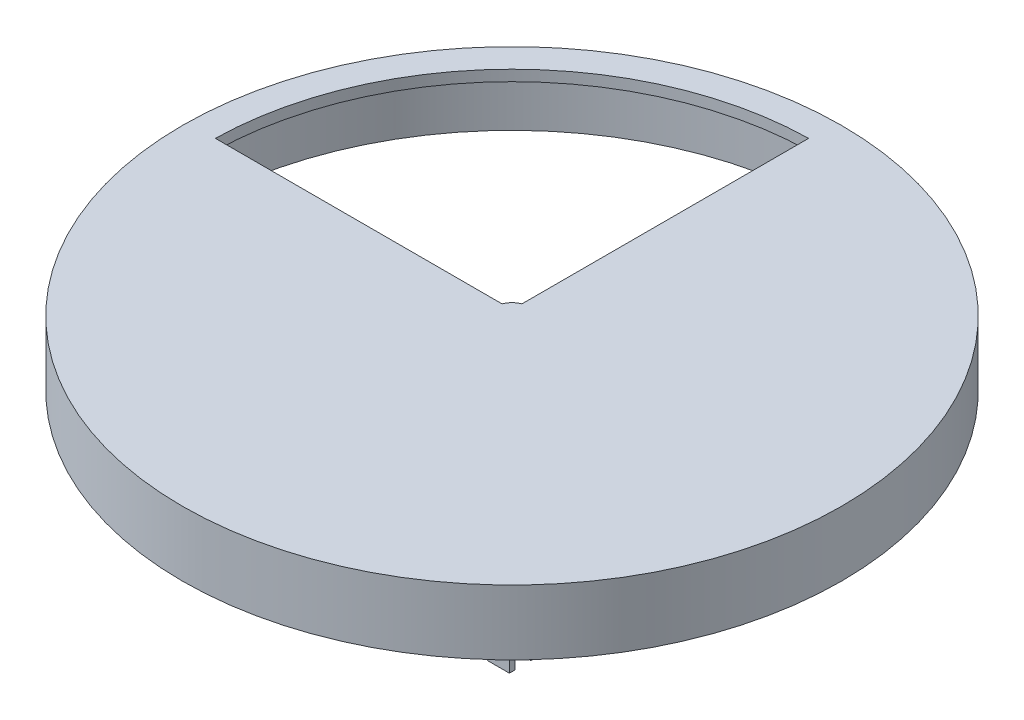
ISO-10303-21;
HEADER;
FILE_DESCRIPTION(('STEP AP214'),'2;1');
FILE_NAME('part.step','',(''),(''),'','','');
FILE_SCHEMA(('AUTOMOTIVE_DESIGN { 1 0 10303 214 1 1 1 1 }'));
ENDSEC;
DATA;
#1=APPLICATION_CONTEXT('core data for automotive mechanical design processes');
#2=APPLICATION_PROTOCOL_DEFINITION('international standard','automotive_design',2000,#1);
#3=PRODUCT_CONTEXT('',#1,'mechanical');
#4=PRODUCT('Part','Part','',(#3));
#5=PRODUCT_RELATED_PRODUCT_CATEGORY('part','',(#4));
#6=PRODUCT_DEFINITION_FORMATION('','',#4);
#7=PRODUCT_DEFINITION_CONTEXT('part definition',#1,'design');
#8=PRODUCT_DEFINITION('design','',#6,#7);
#9=PRODUCT_DEFINITION_SHAPE('','',#8);
#10=(LENGTH_UNIT() NAMED_UNIT(*) SI_UNIT(.MILLI.,.METRE.));
#11=(NAMED_UNIT(*) PLANE_ANGLE_UNIT() SI_UNIT($,.RADIAN.));
#12=(NAMED_UNIT(*) SI_UNIT($,.STERADIAN.) SOLID_ANGLE_UNIT());
#13=UNCERTAINTY_MEASURE_WITH_UNIT(LENGTH_MEASURE(1.E-05),#10,'distance_accuracy_value','');
#14=(GEOMETRIC_REPRESENTATION_CONTEXT(3) GLOBAL_UNCERTAINTY_ASSIGNED_CONTEXT((#13)) GLOBAL_UNIT_ASSIGNED_CONTEXT((#10,
#11,#12)) REPRESENTATION_CONTEXT('',''));
#15=CARTESIAN_POINT('',(0.,0.,0.));
#16=DIRECTION('',(0.,0.,1.));
#17=DIRECTION('',(1.,0.,0.));
#18=AXIS2_PLACEMENT_3D('',#15,#16,#17);
#19=CARTESIAN_POINT('',(0.,-10.,0.));
#20=DIRECTION('',(0.,1.,0.));
#21=DIRECTION('',(0.,0.,1.));
#22=AXIS2_PLACEMENT_3D('',#19,#20,#21);
#23=CYLINDRICAL_SURFACE('',#22,3.);
#24=DIRECTION('',(0.,1.,0.));
#25=VECTOR('',#24,1.);
#26=CARTESIAN_POINT('',(1.6583123951777,-10.,-2.5));
#27=LINE('',#26,#25);
#28=CARTESIAN_POINT('',(1.6583123951777,-10.,-2.5));
#29=VERTEX_POINT('',#28);
#30=CARTESIAN_POINT('',(1.6583123951777,0.,-2.5));
#31=VERTEX_POINT('',#30);
#32=EDGE_CURVE('E175',#29,#31,#27,.T.);
#33=ORIENTED_EDGE('',*,*,#32,.F.);
#34=CARTESIAN_POINT('',(0.,-10.,0.));
#35=DIRECTION('',(0.,-1.,0.));
#36=DIRECTION('',(0.,0.,-1.));
#37=AXIS2_PLACEMENT_3D('',#34,#35,#36);
#38=CIRCLE('',#37,3.);
#39=CARTESIAN_POINT('',(-2.02043256713658,-10.,2.21762310631313));
#40=VERTEX_POINT('',#39);
#41=EDGE_CURVE('E271',#40,#29,#38,.T.);
#42=ORIENTED_EDGE('',*,*,#41,.F.);
#43=DIRECTION('',(0.,1.,0.));
#44=VECTOR('',#43,1.);
#45=CARTESIAN_POINT('',(-2.02043256713658,-10.,2.21762310631313));
#46=LINE('',#45,#44);
#47=CARTESIAN_POINT('',(-2.02043256713658,0.,2.21762310631313));
#48=VERTEX_POINT('',#47);
#49=EDGE_CURVE('E239',#40,#48,#46,.T.);
#50=ORIENTED_EDGE('',*,*,#49,.T.);
#51=CARTESIAN_POINT('',(0.,0.,0.));
#52=DIRECTION('',(0.,1.,0.));
#53=DIRECTION('',(0.,0.,1.));
#54=AXIS2_PLACEMENT_3D('',#51,#52,#53);
#55=CIRCLE('',#54,3.);
#56=CARTESIAN_POINT('',(-2.8284271247462,0.,-0.999999999999987));
#57=VERTEX_POINT('',#56);
#58=EDGE_CURVE('E287',#48,#57,#55,.F.);
#59=ORIENTED_EDGE('',*,*,#58,.T.);
#60=DIRECTION('',(0.,1.,0.));
#61=VECTOR('',#60,1.);
#62=CARTESIAN_POINT('',(-2.8284271247462,-8.,-0.999999999999987));
#63=LINE('',#62,#61);
#64=CARTESIAN_POINT('',(-2.8284271247462,2.,-0.999999999999987));
#65=VERTEX_POINT('',#64);
#66=EDGE_CURVE('E263',#57,#65,#63,.T.);
#67=ORIENTED_EDGE('',*,*,#66,.T.);
#68=CARTESIAN_POINT('',(0.,2.,0.));
#69=DIRECTION('',(0.,1.,0.));
#70=DIRECTION('',(0.,0.,1.));
#71=AXIS2_PLACEMENT_3D('',#68,#69,#70);
#72=CIRCLE('',#71,2.99999999999999);
#73=CARTESIAN_POINT('',(-1.,2.,-2.82842712474619));
#74=VERTEX_POINT('',#73);
#75=EDGE_CURVE('E251',#65,#74,#72,.F.);
#76=ORIENTED_EDGE('',*,*,#75,.T.);
#77=DIRECTION('',(0.,1.,0.));
#78=VECTOR('',#77,1.);
#79=CARTESIAN_POINT('',(-1.,-8.,-2.82842712474619));
#80=LINE('',#79,#78);
#81=CARTESIAN_POINT('',(-1.,0.,-2.82842712474619));
#82=VERTEX_POINT('',#81);
#83=EDGE_CURVE('E261',#82,#74,#80,.T.);
#84=ORIENTED_EDGE('',*,*,#83,.F.);
#85=EDGE_CURVE('E288',#82,#31,#55,.F.);
#86=ORIENTED_EDGE('',*,*,#85,.T.);
#87=EDGE_LOOP('',(#33,#42,#50,#59,#67,#76,#84,#86));
#88=FACE_BOUND('',#87,.T.);
#89=ADVANCED_FACE('F39',(#88),#23,.T.);
#90=CARTESIAN_POINT('',(1.6583123951777,-10.,2.5));
#91=VERTEX_POINT('',#90);
#92=CARTESIAN_POINT('',(-1.6583123951777,-10.,2.5));
#93=VERTEX_POINT('',#92);
#94=EDGE_CURVE('E274',#91,#93,#38,.T.);
#95=ORIENTED_EDGE('',*,*,#94,.F.);
#96=DIRECTION('',(0.,1.,0.));
#97=VECTOR('',#96,1.);
#98=CARTESIAN_POINT('',(1.6583123951777,-10.,2.5));
#99=LINE('',#98,#97);
#100=CARTESIAN_POINT('',(1.6583123951777,0.,2.5));
#101=VERTEX_POINT('',#100);
#102=EDGE_CURVE('E243',#91,#101,#99,.T.);
#103=ORIENTED_EDGE('',*,*,#102,.T.);
#104=CARTESIAN_POINT('',(-1.6583123951777,0.,2.5));
#105=VERTEX_POINT('',#104);
#106=EDGE_CURVE('E291',#101,#105,#55,.F.);
#107=ORIENTED_EDGE('',*,*,#106,.T.);
#108=DIRECTION('',(0.,1.,0.));
#109=VECTOR('',#108,1.);
#110=CARTESIAN_POINT('',(-1.6583123951777,-10.,2.5));
#111=LINE('',#110,#109);
#112=EDGE_CURVE('E241',#105,#93,#111,.F.);
#113=ORIENTED_EDGE('',*,*,#112,.T.);
#114=EDGE_LOOP('',(#95,#103,#107,#113));
#115=FACE_BOUND('',#114,.T.);
#116=ADVANCED_FACE('F371',(#115),#23,.T.);
#117=CARTESIAN_POINT('',(0.,-10.,0.));
#118=DIRECTION('',(0.,-1.,0.));
#119=DIRECTION('',(0.,0.,-1.));
#120=AXIS2_PLACEMENT_3D('',#117,#118,#119);
#121=PLANE('',#120);
#122=DIRECTION('',(-1.,0.,0.));
#123=VECTOR('',#122,1.);
#124=CARTESIAN_POINT('',(0.,-10.,2.5));
#125=LINE('',#124,#123);
#126=EDGE_CURVE('E301',#91,#93,#125,.T.);
#127=ORIENTED_EDGE('',*,*,#126,.F.);
#128=ORIENTED_EDGE('',*,*,#94,.T.);
#129=EDGE_LOOP('',(#127,#128));
#130=FACE_BOUND('',#129,.T.);
#131=ADVANCED_FACE('F388',(#130),#121,.T.);
#132=CARTESIAN_POINT('',(0.,2.,0.));
#133=DIRECTION('',(0.,1.,0.));
#134=DIRECTION('',(0.,0.,1.));
#135=AXIS2_PLACEMENT_3D('',#132,#133,#134);
#136=PLANE('',#135);
#137=CARTESIAN_POINT('',(0.,2.,0.));
#138=DIRECTION('',(0.,1.,0.));
#139=DIRECTION('',(0.,0.,1.));
#140=AXIS2_PLACEMENT_3D('',#137,#138,#139);
#141=CIRCLE('',#140,61.);
#142=CARTESIAN_POINT('',(0.,2.,61.));
#143=VERTEX_POINT('',#142);
#144=EDGE_CURVE('E284',#143,#143,#141,.T.);
#145=ORIENTED_EDGE('',*,*,#144,.T.);
#146=EDGE_LOOP('',(#145));
#147=FACE_BOUND('',#146,.T.);
#148=DIRECTION('',(-1.,0.,0.));
#149=VECTOR('',#148,1.);
#150=CARTESIAN_POINT('',(0.,2.,-0.999999999999987));
#151=LINE('',#150,#149);
#152=CARTESIAN_POINT('',(-55.8834595248794,2.,-0.999999999999986));
#153=VERTEX_POINT('',#152);
#154=EDGE_CURVE('E248',#65,#153,#151,.T.);
#155=ORIENTED_EDGE('',*,*,#154,.T.);
#156=CARTESIAN_POINT('',(1.11022302462516E-13,2.,1.07552855510562E-13));
#157=DIRECTION('',(0.,1.,0.));
#158=DIRECTION('',(0.,0.,1.));
#159=AXIS2_PLACEMENT_3D('',#156,#157,#158);
#160=CIRCLE('',#159,55.8924060000001);
#161=CARTESIAN_POINT('',(-1.,2.,-55.8834595248794));
#162=VERTEX_POINT('',#161);
#163=EDGE_CURVE('E245',#153,#162,#160,.F.);
#164=ORIENTED_EDGE('',*,*,#163,.T.);
#165=DIRECTION('',(0.,0.,1.));
#166=VECTOR('',#165,1.);
#167=CARTESIAN_POINT('',(-1.,2.,0.));
#168=LINE('',#167,#166);
#169=EDGE_CURVE('E254',#162,#74,#168,.T.);
#170=ORIENTED_EDGE('',*,*,#169,.T.);
#171=ORIENTED_EDGE('',*,*,#75,.F.);
#172=EDGE_LOOP('',(#155,#164,#170,#171));
#173=FACE_BOUND('',#172,.T.);
#174=ADVANCED_FACE('F356',(#147,#173),#136,.T.);
#175=CARTESIAN_POINT('',(0.,0.,0.));
#176=DIRECTION('',(0.,1.,0.));
#177=DIRECTION('',(0.,0.,1.));
#178=AXIS2_PLACEMENT_3D('',#175,#176,#177);
#179=PLANE('',#178);
#180=CARTESIAN_POINT('',(0.,0.,0.));
#181=DIRECTION('',(0.,-1.,0.));
#182=DIRECTION('',(0.,0.,-1.));
#183=AXIS2_PLACEMENT_3D('',#180,#181,#182);
#184=CIRCLE('',#183,59.);
#185=CARTESIAN_POINT('',(0.,0.,-59.));
#186=VERTEX_POINT('',#185);
#187=EDGE_CURVE('E279',#186,#186,#184,.T.);
#188=ORIENTED_EDGE('',*,*,#187,.T.);
#189=EDGE_LOOP('',(#188));
#190=FACE_BOUND('',#189,.T.);
#191=CARTESIAN_POINT('',(2.00710285655807,0.,-2.22969462554773));
#192=VERTEX_POINT('',#191);
#193=CARTESIAN_POINT('',(2.01662421689778,0.,2.22108684382701));
#194=VERTEX_POINT('',#193);
#195=EDGE_CURVE('E191',#192,#194,#55,.F.);
#196=ORIENTED_EDGE('',*,*,#195,.F.);
#197=DIRECTION('',(0.,0.,-1.));
#198=VECTOR('',#197,1.);
#199=CARTESIAN_POINT('',(2.00710285655807,0.,-1.50206162252414));
#200=LINE('',#199,#198);
#201=CARTESIAN_POINT('',(2.00710285655807,0.,-2.5));
#202=VERTEX_POINT('',#201);
#203=EDGE_CURVE('E179',#192,#202,#200,.T.);
#204=ORIENTED_EDGE('',*,*,#203,.T.);
#205=DIRECTION('',(1.,0.,0.));
#206=VECTOR('',#205,1.);
#207=CARTESIAN_POINT('',(-1.60766938826074,0.,-2.5));
#208=LINE('',#207,#206);
#209=EDGE_CURVE('E169',#31,#202,#208,.T.);
#210=ORIENTED_EDGE('',*,*,#209,.F.);
#211=ORIENTED_EDGE('',*,*,#85,.F.);
#212=DIRECTION('',(0.,0.,1.));
#213=VECTOR('',#212,1.);
#214=CARTESIAN_POINT('',(-1.,0.,0.));
#215=LINE('',#214,#213);
#216=CARTESIAN_POINT('',(-1.,0.,-55.8834595248794));
#217=VERTEX_POINT('',#216);
#218=EDGE_CURVE('E268',#217,#82,#215,.T.);
#219=ORIENTED_EDGE('',*,*,#218,.F.);
#220=CARTESIAN_POINT('',(1.11022302462516E-13,0.,1.07552855510562E-13));
#221=DIRECTION('',(0.,1.,0.));
#222=DIRECTION('',(0.,0.,1.));
#223=AXIS2_PLACEMENT_3D('',#220,#221,#222);
#224=CIRCLE('',#223,55.8924060000001);
#225=CARTESIAN_POINT('',(-55.8834595248794,0.,-0.999999999999986));
#226=VERTEX_POINT('',#225);
#227=EDGE_CURVE('E290',#226,#217,#224,.F.);
#228=ORIENTED_EDGE('',*,*,#227,.F.);
#229=DIRECTION('',(-1.,0.,0.));
#230=VECTOR('',#229,1.);
#231=CARTESIAN_POINT('',(0.,0.,-0.999999999999987));
#232=LINE('',#231,#230);
#233=EDGE_CURVE('E260',#57,#226,#232,.T.);
#234=ORIENTED_EDGE('',*,*,#233,.F.);
#235=ORIENTED_EDGE('',*,*,#58,.F.);
#236=DIRECTION('',(0.,0.,1.));
#237=VECTOR('',#236,1.);
#238=CARTESIAN_POINT('',(-2.02043256713658,0.,1.5));
#239=LINE('',#238,#237);
#240=CARTESIAN_POINT('',(-2.02043256713658,0.,2.5));
#241=VERTEX_POINT('',#240);
#242=EDGE_CURVE('E62',#48,#241,#239,.T.);
#243=ORIENTED_EDGE('',*,*,#242,.T.);
#244=DIRECTION('',(1.,0.,0.));
#245=VECTOR('',#244,1.);
#246=CARTESIAN_POINT('',(-2.02043256713658,0.,2.5));
#247=LINE('',#246,#245);
#248=EDGE_CURVE('E221',#241,#105,#247,.T.);
#249=ORIENTED_EDGE('',*,*,#248,.T.);
#250=ORIENTED_EDGE('',*,*,#106,.F.);
#251=CARTESIAN_POINT('',(2.01662421689778,0.,2.5));
#252=VERTEX_POINT('',#251);
#253=EDGE_CURVE('E208',#101,#252,#247,.T.);
#254=ORIENTED_EDGE('',*,*,#253,.T.);
#255=DIRECTION('',(0.,0.,-1.));
#256=VECTOR('',#255,1.);
#257=CARTESIAN_POINT('',(2.01662421689778,0.,2.5));
#258=LINE('',#257,#256);
#259=EDGE_CURVE('E223',#252,#194,#258,.T.);
#260=ORIENTED_EDGE('',*,*,#259,.T.);
#261=EDGE_LOOP('',(#196,#204,#210,#211,#219,#228,#234,#235,#243,#249,#250,#254,#260));
#262=FACE_BOUND('',#261,.T.);
#263=ADVANCED_FACE('F189',(#190,#262),#179,.F.);
#264=CARTESIAN_POINT('',(0.,2.,0.));
#265=DIRECTION('',(0.,-1.,0.));
#266=DIRECTION('',(0.,0.,-1.));
#267=AXIS2_PLACEMENT_3D('',#264,#265,#266);
#268=CYLINDRICAL_SURFACE('',#267,61.);
#269=ORIENTED_EDGE('',*,*,#144,.F.);
#270=EDGE_LOOP('',(#269));
#271=FACE_BOUND('',#270,.T.);
#272=CARTESIAN_POINT('',(0.,-10.,0.));
#273=DIRECTION('',(0.,-1.,0.));
#274=DIRECTION('',(0.,0.,-1.));
#275=AXIS2_PLACEMENT_3D('',#272,#273,#274);
#276=CIRCLE('',#275,61.);
#277=CARTESIAN_POINT('',(0.,-10.,-61.));
#278=VERTEX_POINT('',#277);
#279=EDGE_CURVE('E278',#278,#278,#276,.T.);
#280=ORIENTED_EDGE('',*,*,#279,.F.);
#281=EDGE_LOOP('',(#280));
#282=FACE_BOUND('',#281,.T.);
#283=ADVANCED_FACE('F41',(#271,#282),#268,.T.);
#284=CARTESIAN_POINT('',(0.,-10.,0.));
#285=DIRECTION('',(0.,-1.,0.));
#286=DIRECTION('',(0.,0.,-1.));
#287=AXIS2_PLACEMENT_3D('',#284,#285,#286);
#288=PLANE('',#287);
#289=ORIENTED_EDGE('',*,*,#279,.T.);
#290=EDGE_LOOP('',(#289));
#291=FACE_BOUND('',#290,.T.);
#292=CARTESIAN_POINT('',(0.,-10.,0.));
#293=DIRECTION('',(0.,-1.,0.));
#294=DIRECTION('',(0.,0.,-1.));
#295=AXIS2_PLACEMENT_3D('',#292,#293,#294);
#296=CIRCLE('',#295,59.);
#297=CARTESIAN_POINT('',(0.,-10.,-59.));
#298=VERTEX_POINT('',#297);
#299=EDGE_CURVE('E275',#298,#298,#296,.T.);
#300=ORIENTED_EDGE('',*,*,#299,.F.);
#301=EDGE_LOOP('',(#300));
#302=FACE_BOUND('',#301,.T.);
#303=ADVANCED_FACE('F409',(#291,#302),#288,.T.);
#304=CARTESIAN_POINT('',(0.,-10.,0.));
#305=DIRECTION('',(0.,1.,0.));
#306=DIRECTION('',(0.,0.,1.));
#307=AXIS2_PLACEMENT_3D('',#304,#305,#306);
#308=CYLINDRICAL_SURFACE('',#307,59.);
#309=ORIENTED_EDGE('',*,*,#299,.T.);
#310=EDGE_LOOP('',(#309));
#311=FACE_BOUND('',#310,.T.);
#312=ORIENTED_EDGE('',*,*,#187,.F.);
#313=EDGE_LOOP('',(#312));
#314=FACE_BOUND('',#313,.T.);
#315=ADVANCED_FACE('F405',(#311,#314),#308,.F.);
#316=CARTESIAN_POINT('',(2.00710285655807,-10.,-2.22969462554773));
#317=VERTEX_POINT('',#316);
#318=CARTESIAN_POINT('',(2.01662421689778,-10.,2.22108684382701));
#319=VERTEX_POINT('',#318);
#320=EDGE_CURVE('E270',#317,#319,#38,.T.);
#321=ORIENTED_EDGE('',*,*,#320,.F.);
#322=DIRECTION('',(0.,1.,0.));
#323=VECTOR('',#322,1.);
#324=CARTESIAN_POINT('',(2.00710285655807,-10.,-2.22969462554773));
#325=LINE('',#324,#323);
#326=EDGE_CURVE('E193',#317,#192,#325,.T.);
#327=ORIENTED_EDGE('',*,*,#326,.T.);
#328=ORIENTED_EDGE('',*,*,#195,.T.);
#329=DIRECTION('',(0.,1.,0.));
#330=VECTOR('',#329,1.);
#331=CARTESIAN_POINT('',(2.01662421689778,-10.,2.22108684382701));
#332=LINE('',#331,#330);
#333=EDGE_CURVE('E228',#194,#319,#332,.F.);
#334=ORIENTED_EDGE('',*,*,#333,.T.);
#335=EDGE_LOOP('',(#321,#327,#328,#334));
#336=FACE_BOUND('',#335,.T.);
#337=ADVANCED_FACE('F374',(#336),#23,.T.);
#338=DIRECTION('',(0.,0.,1.));
#339=VECTOR('',#338,1.);
#340=CARTESIAN_POINT('',(2.00710285655807,-10.,0.));
#341=LINE('',#340,#339);
#342=CARTESIAN_POINT('',(2.00710285655807,-10.,-1.50206162252414));
#343=VERTEX_POINT('',#342);
#344=EDGE_CURVE('E11',#317,#343,#341,.T.);
#345=ORIENTED_EDGE('',*,*,#344,.F.);
#346=ORIENTED_EDGE('',*,*,#320,.T.);
#347=DIRECTION('',(0.,0.,1.));
#348=VECTOR('',#347,1.);
#349=CARTESIAN_POINT('',(2.01662421689777,-10.,0.));
#350=LINE('',#349,#348);
#351=CARTESIAN_POINT('',(2.01662421689778,-10.,1.5));
#352=VERTEX_POINT('',#351);
#353=EDGE_CURVE('E293',#352,#319,#350,.T.);
#354=ORIENTED_EDGE('',*,*,#353,.F.);
#355=DIRECTION('',(-1.,0.,0.));
#356=VECTOR('',#355,1.);
#357=CARTESIAN_POINT('',(0.,-10.,1.5));
#358=LINE('',#357,#356);
#359=CARTESIAN_POINT('',(-2.02043256713658,-10.,1.5));
#360=VERTEX_POINT('',#359);
#361=EDGE_CURVE('E296',#352,#360,#358,.T.);
#362=ORIENTED_EDGE('',*,*,#361,.T.);
#363=DIRECTION('',(0.,0.,-1.));
#364=VECTOR('',#363,1.);
#365=CARTESIAN_POINT('',(-2.02043256713658,-10.,0.));
#366=LINE('',#365,#364);
#367=EDGE_CURVE('E298',#40,#360,#366,.T.);
#368=ORIENTED_EDGE('',*,*,#367,.F.);
#369=ORIENTED_EDGE('',*,*,#41,.T.);
#370=DIRECTION('',(-1.,0.,0.));
#371=VECTOR('',#370,1.);
#372=CARTESIAN_POINT('',(0.,-10.,-2.5));
#373=LINE('',#372,#371);
#374=CARTESIAN_POINT('',(-1.60766938826074,-10.,-2.5));
#375=VERTEX_POINT('',#374);
#376=EDGE_CURVE('E304',#29,#375,#373,.T.);
#377=ORIENTED_EDGE('',*,*,#376,.T.);
#378=CARTESIAN_POINT('',(-3.19638073863366,-10.,-4.22772678453131));
#379=DIRECTION('',(0.,-1.,0.));
#380=DIRECTION('',(0.,0.,-1.));
#381=AXIS2_PLACEMENT_3D('',#378,#379,#380);
#382=CIRCLE('',#381,2.34713518928728);
#383=CARTESIAN_POINT('',(-1.99289714344193,-10.,-2.2126161590581));
#384=VERTEX_POINT('',#383);
#385=EDGE_CURVE('E307',#384,#375,#382,.F.);
#386=ORIENTED_EDGE('',*,*,#385,.F.);
#387=DIRECTION('',(0.,0.,-1.));
#388=VECTOR('',#387,1.);
#389=CARTESIAN_POINT('',(-1.99289714344193,-10.,0.));
#390=LINE('',#389,#388);
#391=CARTESIAN_POINT('',(-1.99289714344193,-10.,-1.50206162252414));
#392=VERTEX_POINT('',#391);
#393=EDGE_CURVE('E309',#392,#384,#390,.T.);
#394=ORIENTED_EDGE('',*,*,#393,.F.);
#395=DIRECTION('',(1.,0.,0.));
#396=VECTOR('',#395,1.);
#397=CARTESIAN_POINT('',(0.,-10.,-1.50206162252414));
#398=LINE('',#397,#396);
#399=EDGE_CURVE('E47',#392,#343,#398,.T.);
#400=ORIENTED_EDGE('',*,*,#399,.T.);
#401=EDGE_LOOP('',(#345,#346,#354,#362,#368,#369,#377,#386,#394,#400));
#402=FACE_BOUND('',#401,.T.);
#403=ADVANCED_FACE('F314',(#402),#121,.T.);
#404=CARTESIAN_POINT('',(1.11022302462516E-13,-8.,1.07552855510562E-13));
#405=DIRECTION('',(0.,1.,0.));
#406=DIRECTION('',(0.,0.,1.));
#407=AXIS2_PLACEMENT_3D('',#404,#405,#406);
#408=CYLINDRICAL_SURFACE('',#407,55.8924060000001);
#409=ORIENTED_EDGE('',*,*,#227,.T.);
#410=DIRECTION('',(0.,1.,0.));
#411=VECTOR('',#410,1.);
#412=CARTESIAN_POINT('',(-1.,-8.,-55.8834595248794));
#413=LINE('',#412,#411);
#414=EDGE_CURVE('E258',#217,#162,#413,.T.);
#415=ORIENTED_EDGE('',*,*,#414,.T.);
#416=ORIENTED_EDGE('',*,*,#163,.F.);
#417=DIRECTION('',(0.,1.,0.));
#418=VECTOR('',#417,1.);
#419=CARTESIAN_POINT('',(-55.8834595248794,-8.,-0.999999999999986));
#420=LINE('',#419,#418);
#421=EDGE_CURVE('E257',#226,#153,#420,.T.);
#422=ORIENTED_EDGE('',*,*,#421,.F.);
#423=EDGE_LOOP('',(#409,#415,#416,#422));
#424=FACE_BOUND('',#423,.T.);
#425=ADVANCED_FACE('F348',(#424),#408,.F.);
#426=CARTESIAN_POINT('',(-1.,-8.,0.));
#427=DIRECTION('',(-1.,0.,0.));
#428=DIRECTION('',(0.,0.,1.));
#429=AXIS2_PLACEMENT_3D('',#426,#427,#428);
#430=PLANE('',#429);
#431=ORIENTED_EDGE('',*,*,#218,.T.);
#432=ORIENTED_EDGE('',*,*,#83,.T.);
#433=ORIENTED_EDGE('',*,*,#169,.F.);
#434=ORIENTED_EDGE('',*,*,#414,.F.);
#435=EDGE_LOOP('',(#431,#432,#433,#434));
#436=FACE_BOUND('',#435,.T.);
#437=ADVANCED_FACE('F345',(#436),#430,.T.);
#438=CARTESIAN_POINT('',(0.,-8.,-0.999999999999987));
#439=DIRECTION('',(0.,0.,-1.));
#440=DIRECTION('',(-1.,0.,0.));
#441=AXIS2_PLACEMENT_3D('',#438,#439,#440);
#442=PLANE('',#441);
#443=ORIENTED_EDGE('',*,*,#233,.T.);
#444=ORIENTED_EDGE('',*,*,#421,.T.);
#445=ORIENTED_EDGE('',*,*,#154,.F.);
#446=ORIENTED_EDGE('',*,*,#66,.F.);
#447=EDGE_LOOP('',(#443,#444,#445,#446));
#448=FACE_BOUND('',#447,.T.);
#449=ADVANCED_FACE('F352',(#448),#442,.T.);
#450=CARTESIAN_POINT('',(-2.02043256713658,-53.,2.5));
#451=DIRECTION('',(0.,0.,1.));
#452=DIRECTION('',(1.,0.,0.));
#453=AXIS2_PLACEMENT_3D('',#450,#451,#452);
#454=PLANE('',#453);
#455=ORIENTED_EDGE('',*,*,#102,.F.);
#456=ORIENTED_EDGE('',*,*,#126,.T.);
#457=ORIENTED_EDGE('',*,*,#112,.F.);
#458=ORIENTED_EDGE('',*,*,#248,.F.);
#459=DIRECTION('',(0.,1.,0.));
#460=VECTOR('',#459,1.);
#461=CARTESIAN_POINT('',(-2.02043256713658,-53.,2.5));
#462=LINE('',#461,#460);
#463=CARTESIAN_POINT('',(-2.02043256713658,-53.,2.5));
#464=VERTEX_POINT('',#463);
#465=EDGE_CURVE('E226',#464,#241,#462,.T.);
#466=ORIENTED_EDGE('',*,*,#465,.F.);
#467=DIRECTION('',(1.,0.,0.));
#468=VECTOR('',#467,1.);
#469=CARTESIAN_POINT('',(-2.02043256713658,-53.,2.5));
#470=LINE('',#469,#468);
#471=CARTESIAN_POINT('',(2.01662421689778,-53.,2.5));
#472=VERTEX_POINT('',#471);
#473=EDGE_CURVE('E209',#464,#472,#470,.T.);
#474=ORIENTED_EDGE('',*,*,#473,.T.);
#475=DIRECTION('',(0.,1.,0.));
#476=VECTOR('',#475,1.);
#477=CARTESIAN_POINT('',(2.01662421689778,-53.,2.5));
#478=LINE('',#477,#476);
#479=EDGE_CURVE('E220',#472,#252,#478,.T.);
#480=ORIENTED_EDGE('',*,*,#479,.T.);
#481=ORIENTED_EDGE('',*,*,#253,.F.);
#482=EDGE_LOOP('',(#455,#456,#457,#458,#466,#474,#480,#481));
#483=FACE_BOUND('',#482,.T.);
#484=ADVANCED_FACE('F365',(#483),#454,.T.);
#485=CARTESIAN_POINT('',(-2.02043256713658,-53.,1.5));
#486=DIRECTION('',(-1.,0.,0.));
#487=DIRECTION('',(0.,0.,1.));
#488=AXIS2_PLACEMENT_3D('',#485,#486,#487);
#489=PLANE('',#488);
#490=ORIENTED_EDGE('',*,*,#49,.F.);
#491=ORIENTED_EDGE('',*,*,#367,.T.);
#492=DIRECTION('',(0.,1.,0.));
#493=VECTOR('',#492,1.);
#494=CARTESIAN_POINT('',(-2.02043256713658,-53.,1.5));
#495=LINE('',#494,#493);
#496=CARTESIAN_POINT('',(-2.02043256713658,-53.,1.5));
#497=VERTEX_POINT('',#496);
#498=EDGE_CURVE('E229',#497,#360,#495,.T.);
#499=ORIENTED_EDGE('',*,*,#498,.F.);
#500=DIRECTION('',(0.,0.,1.));
#501=VECTOR('',#500,1.);
#502=CARTESIAN_POINT('',(-2.02043256713658,-53.,1.5));
#503=LINE('',#502,#501);
#504=EDGE_CURVE('E217',#497,#464,#503,.T.);
#505=ORIENTED_EDGE('',*,*,#504,.T.);
#506=ORIENTED_EDGE('',*,*,#465,.T.);
#507=ORIENTED_EDGE('',*,*,#242,.F.);
#508=EDGE_LOOP('',(#490,#491,#499,#505,#506,#507));
#509=FACE_BOUND('',#508,.T.);
#510=ADVANCED_FACE('F358',(#509),#489,.T.);
#511=CARTESIAN_POINT('',(2.01662421689778,-53.,2.5));
#512=DIRECTION('',(1.,0.,0.));
#513=DIRECTION('',(0.,0.,-1.));
#514=AXIS2_PLACEMENT_3D('',#511,#512,#513);
#515=PLANE('',#514);
#516=ORIENTED_EDGE('',*,*,#333,.F.);
#517=ORIENTED_EDGE('',*,*,#259,.F.);
#518=ORIENTED_EDGE('',*,*,#479,.F.);
#519=DIRECTION('',(0.,0.,-1.));
#520=VECTOR('',#519,1.);
#521=CARTESIAN_POINT('',(2.01662421689778,-53.,2.5));
#522=LINE('',#521,#520);
#523=CARTESIAN_POINT('',(2.01662421689778,-53.,1.5));
#524=VERTEX_POINT('',#523);
#525=EDGE_CURVE('E212',#472,#524,#522,.T.);
#526=ORIENTED_EDGE('',*,*,#525,.T.);
#527=DIRECTION('',(0.,1.,0.));
#528=VECTOR('',#527,1.);
#529=CARTESIAN_POINT('',(2.01662421689778,-53.,1.5));
#530=LINE('',#529,#528);
#531=EDGE_CURVE('E232',#524,#352,#530,.T.);
#532=ORIENTED_EDGE('',*,*,#531,.T.);
#533=ORIENTED_EDGE('',*,*,#353,.T.);
#534=EDGE_LOOP('',(#516,#517,#518,#526,#532,#533));
#535=FACE_BOUND('',#534,.T.);
#536=ADVANCED_FACE('F378',(#535),#515,.T.);
#537=CARTESIAN_POINT('',(-2.02043256713658,-53.,1.5));
#538=DIRECTION('',(0.,0.,1.));
#539=DIRECTION('',(1.,0.,0.));
#540=AXIS2_PLACEMENT_3D('',#537,#538,#539);
#541=PLANE('',#540);
#542=ORIENTED_EDGE('',*,*,#361,.F.);
#543=ORIENTED_EDGE('',*,*,#531,.F.);
#544=DIRECTION('',(1.,0.,0.));
#545=VECTOR('',#544,1.);
#546=CARTESIAN_POINT('',(-2.02043256713658,-53.,1.5));
#547=LINE('',#546,#545);
#548=EDGE_CURVE('E215',#497,#524,#547,.T.);
#549=ORIENTED_EDGE('',*,*,#548,.F.);
#550=ORIENTED_EDGE('',*,*,#498,.T.);
#551=EDGE_LOOP('',(#542,#543,#549,#550));
#552=FACE_BOUND('',#551,.T.);
#553=ADVANCED_FACE('F382',(#552),#541,.F.);
#554=CARTESIAN_POINT('',(0.,-53.,0.));
#555=DIRECTION('',(0.,1.,0.));
#556=DIRECTION('',(0.,0.,1.));
#557=AXIS2_PLACEMENT_3D('',#554,#555,#556);
#558=PLANE('',#557);
#559=ORIENTED_EDGE('',*,*,#473,.F.);
#560=ORIENTED_EDGE('',*,*,#504,.F.);
#561=ORIENTED_EDGE('',*,*,#548,.T.);
#562=ORIENTED_EDGE('',*,*,#525,.F.);
#563=EDGE_LOOP('',(#559,#560,#561,#562));
#564=FACE_BOUND('',#563,.T.);
#565=ADVANCED_FACE('F386',(#564),#558,.F.);
#566=CARTESIAN_POINT('',(2.00710285655807,-53.,-1.50206162252414));
#567=DIRECTION('',(1.,0.,0.));
#568=DIRECTION('',(0.,0.,-1.));
#569=AXIS2_PLACEMENT_3D('',#566,#567,#568);
#570=PLANE('',#569);
#571=ORIENTED_EDGE('',*,*,#326,.F.);
#572=ORIENTED_EDGE('',*,*,#344,.T.);
#573=DIRECTION('',(0.,1.,0.));
#574=VECTOR('',#573,1.);
#575=CARTESIAN_POINT('',(2.00710285655807,-53.,-1.50206162252414));
#576=LINE('',#575,#574);
#577=CARTESIAN_POINT('',(2.00710285655807,-53.,-1.50206162252414));
#578=VERTEX_POINT('',#577);
#579=EDGE_CURVE('E324',#578,#343,#576,.T.);
#580=ORIENTED_EDGE('',*,*,#579,.F.);
#581=DIRECTION('',(0.,0.,-1.));
#582=VECTOR('',#581,1.);
#583=CARTESIAN_POINT('',(2.00710285655807,-53.,-1.50206162252414));
#584=LINE('',#583,#582);
#585=CARTESIAN_POINT('',(2.00710285655807,-53.,-2.5));
#586=VERTEX_POINT('',#585);
#587=EDGE_CURVE('E180',#578,#586,#584,.T.);
#588=ORIENTED_EDGE('',*,*,#587,.T.);
#589=DIRECTION('',(0.,1.,0.));
#590=VECTOR('',#589,1.);
#591=CARTESIAN_POINT('',(2.00710285655807,-53.,-2.5));
#592=LINE('',#591,#590);
#593=EDGE_CURVE('E172',#586,#202,#592,.T.);
#594=ORIENTED_EDGE('',*,*,#593,.T.);
#595=ORIENTED_EDGE('',*,*,#203,.F.);
#596=EDGE_LOOP('',(#571,#572,#580,#588,#594,#595));
#597=FACE_BOUND('',#596,.T.);
#598=ADVANCED_FACE('F183',(#597),#570,.T.);
#599=CARTESIAN_POINT('',(-1.60766938826074,-53.,-2.5));
#600=DIRECTION('',(0.,0.,1.));
#601=DIRECTION('',(1.,0.,0.));
#602=AXIS2_PLACEMENT_3D('',#599,#600,#601);
#603=PLANE('',#602);
#604=ORIENTED_EDGE('',*,*,#376,.F.);
#605=ORIENTED_EDGE('',*,*,#32,.T.);
#606=ORIENTED_EDGE('',*,*,#209,.T.);
#607=ORIENTED_EDGE('',*,*,#593,.F.);
#608=DIRECTION('',(1.,0.,0.));
#609=VECTOR('',#608,1.);
#610=CARTESIAN_POINT('',(-1.60766938826074,-53.,-2.5));
#611=LINE('',#610,#609);
#612=CARTESIAN_POINT('',(-1.60766938826074,-53.,-2.5));
#613=VERTEX_POINT('',#612);
#614=EDGE_CURVE('E204',#613,#586,#611,.T.);
#615=ORIENTED_EDGE('',*,*,#614,.F.);
#616=DIRECTION('',(0.,1.,0.));
#617=VECTOR('',#616,1.);
#618=CARTESIAN_POINT('',(-1.60766938826074,-53.,-2.5));
#619=LINE('',#618,#617);
#620=EDGE_CURVE('E54',#613,#375,#619,.T.);
#621=ORIENTED_EDGE('',*,*,#620,.T.);
#622=EDGE_LOOP('',(#604,#605,#606,#607,#615,#621));
#623=FACE_BOUND('',#622,.T.);
#624=ADVANCED_FACE('F171',(#623),#603,.F.);
#625=CARTESIAN_POINT('',(2.00710285655807,-53.,-1.50206162252414));
#626=DIRECTION('',(0.,0.,-1.));
#627=DIRECTION('',(-1.,0.,0.));
#628=AXIS2_PLACEMENT_3D('',#625,#626,#627);
#629=PLANE('',#628);
#630=ORIENTED_EDGE('',*,*,#399,.F.);
#631=DIRECTION('',(0.,1.,0.));
#632=VECTOR('',#631,1.);
#633=CARTESIAN_POINT('',(-1.99289714344193,-53.,-1.50206162252414));
#634=LINE('',#633,#632);
#635=CARTESIAN_POINT('',(-1.99289714344193,-53.,-1.50206162252414));
#636=VERTEX_POINT('',#635);
#637=EDGE_CURVE('E323',#636,#392,#634,.T.);
#638=ORIENTED_EDGE('',*,*,#637,.F.);
#639=DIRECTION('',(-1.,0.,0.));
#640=VECTOR('',#639,1.);
#641=CARTESIAN_POINT('',(2.00710285655807,-53.,-1.50206162252414));
#642=LINE('',#641,#640);
#643=EDGE_CURVE('E186',#578,#636,#642,.T.);
#644=ORIENTED_EDGE('',*,*,#643,.F.);
#645=ORIENTED_EDGE('',*,*,#579,.T.);
#646=EDGE_LOOP('',(#630,#638,#644,#645));
#647=FACE_BOUND('',#646,.T.);
#648=ADVANCED_FACE('F321',(#647),#629,.F.);
#649=CARTESIAN_POINT('',(-1.99289714344193,-53.,-2.2126161590581));
#650=DIRECTION('',(-1.,0.,0.));
#651=DIRECTION('',(0.,0.,1.));
#652=AXIS2_PLACEMENT_3D('',#649,#650,#651);
#653=PLANE('',#652);
#654=ORIENTED_EDGE('',*,*,#637,.T.);
#655=ORIENTED_EDGE('',*,*,#393,.T.);
#656=DIRECTION('',(0.,1.,0.));
#657=VECTOR('',#656,1.);
#658=CARTESIAN_POINT('',(-1.99289714344193,-53.,-2.2126161590581));
#659=LINE('',#658,#657);
#660=CARTESIAN_POINT('',(-1.99289714344193,-53.,-2.2126161590581));
#661=VERTEX_POINT('',#660);
#662=EDGE_CURVE('E329',#661,#384,#659,.T.);
#663=ORIENTED_EDGE('',*,*,#662,.F.);
#664=DIRECTION('',(0.,0.,1.));
#665=VECTOR('',#664,1.);
#666=CARTESIAN_POINT('',(-1.99289714344193,-53.,-2.2126161590581));
#667=LINE('',#666,#665);
#668=EDGE_CURVE('E198',#661,#636,#667,.T.);
#669=ORIENTED_EDGE('',*,*,#668,.T.);
#670=EDGE_LOOP('',(#654,#655,#663,#669));
#671=FACE_BOUND('',#670,.T.);
#672=ADVANCED_FACE('F326',(#671),#653,.T.);
#673=CARTESIAN_POINT('',(-3.19638073863366,-53.,-4.22772678453131));
#674=DIRECTION('',(0.,1.,0.));
#675=DIRECTION('',(0.,0.,1.));
#676=AXIS2_PLACEMENT_3D('',#673,#674,#675);
#677=CYLINDRICAL_SURFACE('',#676,2.34713518928728);
#678=ORIENTED_EDGE('',*,*,#662,.T.);
#679=ORIENTED_EDGE('',*,*,#385,.T.);
#680=ORIENTED_EDGE('',*,*,#620,.F.);
#681=CARTESIAN_POINT('',(-3.19638073863366,-53.,-4.22772678453131));
#682=DIRECTION('',(0.,-1.,0.));
#683=DIRECTION('',(0.,0.,-1.));
#684=AXIS2_PLACEMENT_3D('',#681,#682,#683);
#685=CIRCLE('',#684,2.34713518928728);
#686=EDGE_CURVE('E201',#613,#661,#685,.T.);
#687=ORIENTED_EDGE('',*,*,#686,.T.);
#688=EDGE_LOOP('',(#678,#679,#680,#687));
#689=FACE_BOUND('',#688,.T.);
#690=ADVANCED_FACE('F334',(#689),#677,.F.);
#691=CARTESIAN_POINT('',(-3.19638073863366,-53.,-4.22772678453131));
#692=DIRECTION('',(0.,-1.,0.));
#693=DIRECTION('',(0.,0.,-1.));
#694=AXIS2_PLACEMENT_3D('',#691,#692,#693);
#695=PLANE('',#694);
#696=ORIENTED_EDGE('',*,*,#587,.F.);
#697=ORIENTED_EDGE('',*,*,#643,.T.);
#698=ORIENTED_EDGE('',*,*,#668,.F.);
#699=ORIENTED_EDGE('',*,*,#686,.F.);
#700=ORIENTED_EDGE('',*,*,#614,.T.);
#701=EDGE_LOOP('',(#696,#697,#698,#699,#700));
#702=FACE_BOUND('',#701,.T.);
#703=ADVANCED_FACE('F595',(#702),#695,.T.);
#704=CLOSED_SHELL('',(#89,#116,#131,#174,#263,#283,#303,#315,#337,#403,#425,#437,#449,#484,#510,
#536,#553,#565,#598,#624,#648,#672,#690,#703));
#705=MANIFOLD_SOLID_BREP('B2',#704);
#706=ADVANCED_BREP_SHAPE_REPRESENTATION('',(#18,#705),#14);
#707=SHAPE_DEFINITION_REPRESENTATION(#9,#706);
ENDSEC;
END-ISO-10303-21;
